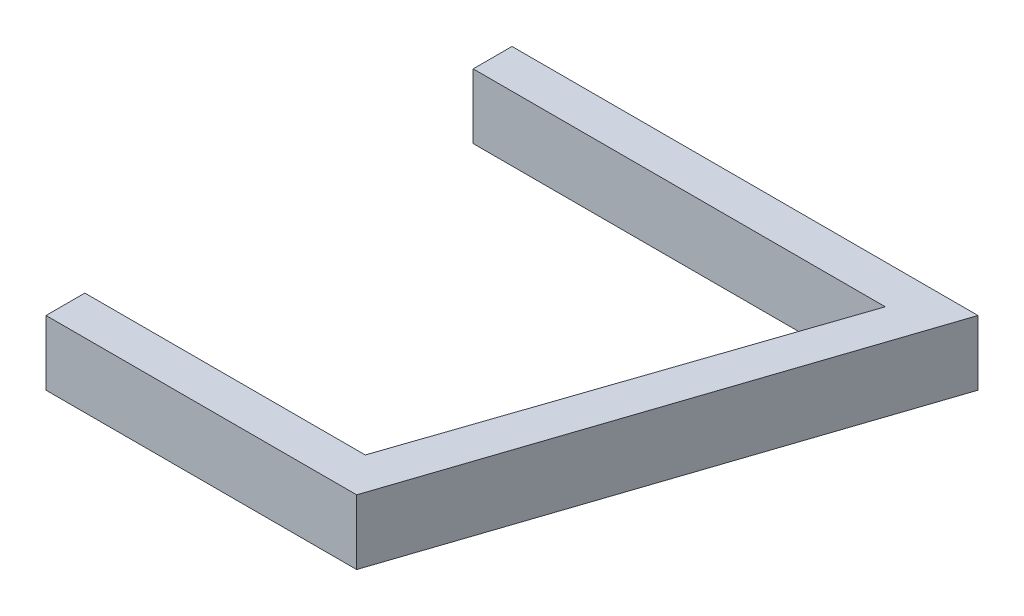
ISO-10303-21;
HEADER;
FILE_DESCRIPTION(('STEP AP214'),'2;1');
FILE_NAME('part.step','',(''),(''),'','','');
FILE_SCHEMA(('AUTOMOTIVE_DESIGN { 1 0 10303 214 1 1 1 1 }'));
ENDSEC;
DATA;
#1=APPLICATION_CONTEXT('core data for automotive mechanical design processes');
#2=APPLICATION_PROTOCOL_DEFINITION('international standard','automotive_design',2000,#1);
#3=PRODUCT_CONTEXT('',#1,'mechanical');
#4=PRODUCT('Part','Part','',(#3));
#5=PRODUCT_RELATED_PRODUCT_CATEGORY('part','',(#4));
#6=PRODUCT_DEFINITION_FORMATION('','',#4);
#7=PRODUCT_DEFINITION_CONTEXT('part definition',#1,'design');
#8=PRODUCT_DEFINITION('design','',#6,#7);
#9=PRODUCT_DEFINITION_SHAPE('','',#8);
#10=(LENGTH_UNIT() NAMED_UNIT(*) SI_UNIT(.MILLI.,.METRE.));
#11=(NAMED_UNIT(*) PLANE_ANGLE_UNIT() SI_UNIT($,.RADIAN.));
#12=(NAMED_UNIT(*) SI_UNIT($,.STERADIAN.) SOLID_ANGLE_UNIT());
#13=UNCERTAINTY_MEASURE_WITH_UNIT(LENGTH_MEASURE(1.E-05),#10,'distance_accuracy_value','');
#14=(GEOMETRIC_REPRESENTATION_CONTEXT(3) GLOBAL_UNCERTAINTY_ASSIGNED_CONTEXT((#13)) GLOBAL_UNIT_ASSIGNED_CONTEXT((#10,
#11,#12)) REPRESENTATION_CONTEXT('',''));
#15=CARTESIAN_POINT('',(0.,0.,0.));
#16=DIRECTION('',(0.,0.,1.));
#17=DIRECTION('',(1.,0.,0.));
#18=AXIS2_PLACEMENT_3D('',#15,#16,#17);
#19=CARTESIAN_POINT('',(-228.6,63.5,0.));
#20=DIRECTION('',(1.,0.,0.));
#21=DIRECTION('',(0.,0.,-1.));
#22=AXIS2_PLACEMENT_3D('',#19,#20,#21);
#23=PLANE('',#22);
#24=DIRECTION('',(0.,0.,1.));
#25=VECTOR('',#24,1.);
#26=CARTESIAN_POINT('',(-228.6,0.,0.));
#27=LINE('',#26,#25);
#28=CARTESIAN_POINT('',(-228.6,0.,0.));
#29=VERTEX_POINT('',#28);
#30=CARTESIAN_POINT('',(-228.6,0.,38.1));
#31=VERTEX_POINT('',#30);
#32=EDGE_CURVE('E129',#29,#31,#27,.T.);
#33=ORIENTED_EDGE('',*,*,#32,.T.);
#34=DIRECTION('',(0.,-1.,0.));
#35=VECTOR('',#34,1.);
#36=CARTESIAN_POINT('',(-228.6,63.5,38.1));
#37=LINE('',#36,#35);
#38=CARTESIAN_POINT('',(-228.6,63.5,38.1));
#39=VERTEX_POINT('',#38);
#40=EDGE_CURVE('E11',#39,#31,#37,.T.);
#41=ORIENTED_EDGE('',*,*,#40,.F.);
#42=DIRECTION('',(0.,0.,1.));
#43=VECTOR('',#42,1.);
#44=CARTESIAN_POINT('',(-228.6,63.5,0.));
#45=LINE('',#44,#43);
#46=CARTESIAN_POINT('',(-228.6,63.5,0.));
#47=VERTEX_POINT('',#46);
#48=EDGE_CURVE('E143',#47,#39,#45,.T.);
#49=ORIENTED_EDGE('',*,*,#48,.F.);
#50=DIRECTION('',(0.,-1.,0.));
#51=VECTOR('',#50,1.);
#52=CARTESIAN_POINT('',(-228.6,63.5,0.));
#53=LINE('',#52,#51);
#54=EDGE_CURVE('E125',#47,#29,#53,.T.);
#55=ORIENTED_EDGE('',*,*,#54,.T.);
#56=EDGE_LOOP('',(#33,#41,#49,#55));
#57=FACE_BOUND('',#56,.T.);
#58=ADVANCED_FACE('F33',(#57),#23,.F.);
#59=CARTESIAN_POINT('',(-228.6,63.5,38.1));
#60=DIRECTION('',(0.,0.,-1.));
#61=DIRECTION('',(-1.,0.,0.));
#62=AXIS2_PLACEMENT_3D('',#59,#60,#61);
#63=PLANE('',#62);
#64=DIRECTION('',(1.,0.,0.));
#65=VECTOR('',#64,1.);
#66=CARTESIAN_POINT('',(-228.6,0.,38.1));
#67=LINE('',#66,#65);
#68=CARTESIAN_POINT('',(175.739073715862,0.,38.0999999999999));
#69=VERTEX_POINT('',#68);
#70=EDGE_CURVE('E132',#31,#69,#67,.T.);
#71=ORIENTED_EDGE('',*,*,#70,.T.);
#72=DIRECTION('',(0.,-1.,0.));
#73=VECTOR('',#72,1.);
#74=CARTESIAN_POINT('',(175.739073715862,63.5,38.0999999999999));
#75=LINE('',#74,#73);
#76=CARTESIAN_POINT('',(175.739073715862,63.5,38.0999999999999));
#77=VERTEX_POINT('',#76);
#78=EDGE_CURVE('E41',#77,#69,#75,.T.);
#79=ORIENTED_EDGE('',*,*,#78,.F.);
#80=DIRECTION('',(1.,0.,0.));
#81=VECTOR('',#80,1.);
#82=CARTESIAN_POINT('',(-228.6,63.5,38.1));
#83=LINE('',#82,#81);
#84=EDGE_CURVE('E92',#39,#77,#83,.T.);
#85=ORIENTED_EDGE('',*,*,#84,.F.);
#86=ORIENTED_EDGE('',*,*,#40,.T.);
#87=EDGE_LOOP('',(#71,#79,#85,#86));
#88=FACE_BOUND('',#87,.T.);
#89=ADVANCED_FACE('F178',(#88),#63,.F.);
#90=CARTESIAN_POINT('',(175.739073715862,63.5,38.0999999999999));
#91=DIRECTION('',(0.947050865355972,0.,0.321083569228488));
#92=DIRECTION('',(0.321083569228488,0.,-0.947050865355972));
#93=AXIS2_PLACEMENT_3D('',#90,#91,#92);
#94=PLANE('',#93);
#95=DIRECTION('',(-0.321083569228488,0.,0.947050865355972));
#96=VECTOR('',#95,1.);
#97=CARTESIAN_POINT('',(175.739073715862,0.,38.0999999999999));
#98=LINE('',#97,#96);
#99=CARTESIAN_POINT('',(46.5666666666668,0.,419.1));
#100=VERTEX_POINT('',#99);
#101=EDGE_CURVE('E134',#69,#100,#98,.T.);
#102=ORIENTED_EDGE('',*,*,#101,.T.);
#103=DIRECTION('',(0.,-1.,0.));
#104=VECTOR('',#103,1.);
#105=CARTESIAN_POINT('',(46.5666666666668,63.5,419.1));
#106=LINE('',#105,#104);
#107=CARTESIAN_POINT('',(46.5666666666668,63.5,419.1));
#108=VERTEX_POINT('',#107);
#109=EDGE_CURVE('E150',#108,#100,#106,.T.);
#110=ORIENTED_EDGE('',*,*,#109,.F.);
#111=DIRECTION('',(-0.321083569228488,0.,0.947050865355972));
#112=VECTOR('',#111,1.);
#113=CARTESIAN_POINT('',(175.739073715862,63.5,38.0999999999999));
#114=LINE('',#113,#112);
#115=EDGE_CURVE('E158',#77,#108,#114,.T.);
#116=ORIENTED_EDGE('',*,*,#115,.F.);
#117=ORIENTED_EDGE('',*,*,#78,.T.);
#118=EDGE_LOOP('',(#102,#110,#116,#117));
#119=FACE_BOUND('',#118,.T.);
#120=ADVANCED_FACE('F156',(#119),#94,.F.);
#121=CARTESIAN_POINT('',(-228.6,63.5,419.1));
#122=DIRECTION('',(0.,0.,1.));
#123=DIRECTION('',(1.,0.,0.));
#124=AXIS2_PLACEMENT_3D('',#121,#122,#123);
#125=PLANE('',#124);
#126=DIRECTION('',(-1.,0.,0.));
#127=VECTOR('',#126,1.);
#128=CARTESIAN_POINT('',(-228.6,0.,419.1));
#129=LINE('',#128,#127);
#130=CARTESIAN_POINT('',(-228.6,0.,419.1));
#131=VERTEX_POINT('',#130);
#132=EDGE_CURVE('E136',#100,#131,#129,.T.);
#133=ORIENTED_EDGE('',*,*,#132,.T.);
#134=DIRECTION('',(0.,-1.,0.));
#135=VECTOR('',#134,1.);
#136=CARTESIAN_POINT('',(-228.6,63.5,419.1));
#137=LINE('',#136,#135);
#138=CARTESIAN_POINT('',(-228.6,63.5,419.1));
#139=VERTEX_POINT('',#138);
#140=EDGE_CURVE('E147',#139,#131,#137,.T.);
#141=ORIENTED_EDGE('',*,*,#140,.F.);
#142=DIRECTION('',(-1.,0.,0.));
#143=VECTOR('',#142,1.);
#144=CARTESIAN_POINT('',(-228.6,63.5,419.1));
#145=LINE('',#144,#143);
#146=EDGE_CURVE('E170',#108,#139,#145,.T.);
#147=ORIENTED_EDGE('',*,*,#146,.F.);
#148=ORIENTED_EDGE('',*,*,#109,.T.);
#149=EDGE_LOOP('',(#133,#141,#147,#148));
#150=FACE_BOUND('',#149,.T.);
#151=ADVANCED_FACE('F166',(#150),#125,.F.);
#152=CARTESIAN_POINT('',(-228.6,63.5,457.2));
#153=DIRECTION('',(1.,0.,0.));
#154=DIRECTION('',(0.,0.,-1.));
#155=AXIS2_PLACEMENT_3D('',#152,#153,#154);
#156=PLANE('',#155);
#157=DIRECTION('',(0.,0.,1.));
#158=VECTOR('',#157,1.);
#159=CARTESIAN_POINT('',(-228.6,0.,457.2));
#160=LINE('',#159,#158);
#161=CARTESIAN_POINT('',(-228.6,0.,457.2));
#162=VERTEX_POINT('',#161);
#163=EDGE_CURVE('E138',#131,#162,#160,.T.);
#164=ORIENTED_EDGE('',*,*,#163,.T.);
#165=DIRECTION('',(0.,-1.,0.));
#166=VECTOR('',#165,1.);
#167=CARTESIAN_POINT('',(-228.6,63.5,457.2));
#168=LINE('',#167,#166);
#169=CARTESIAN_POINT('',(-228.6,63.5,457.2));
#170=VERTEX_POINT('',#169);
#171=EDGE_CURVE('E120',#170,#162,#168,.T.);
#172=ORIENTED_EDGE('',*,*,#171,.F.);
#173=DIRECTION('',(0.,0.,1.));
#174=VECTOR('',#173,1.);
#175=CARTESIAN_POINT('',(-228.6,63.5,457.2));
#176=LINE('',#175,#174);
#177=EDGE_CURVE('E111',#139,#170,#176,.T.);
#178=ORIENTED_EDGE('',*,*,#177,.F.);
#179=ORIENTED_EDGE('',*,*,#140,.T.);
#180=EDGE_LOOP('',(#164,#172,#178,#179));
#181=FACE_BOUND('',#180,.T.);
#182=ADVANCED_FACE('F169',(#181),#156,.F.);
#183=CARTESIAN_POINT('',(-228.6,63.5,457.2));
#184=DIRECTION('',(0.,0.,-1.));
#185=DIRECTION('',(-1.,0.,0.));
#186=AXIS2_PLACEMENT_3D('',#183,#184,#185);
#187=PLANE('',#186);
#188=DIRECTION('',(1.,0.,0.));
#189=VECTOR('',#188,1.);
#190=CARTESIAN_POINT('',(-228.6,0.,457.2));
#191=LINE('',#190,#189);
#192=CARTESIAN_POINT('',(76.2000000000001,0.,457.2));
#193=VERTEX_POINT('',#192);
#194=EDGE_CURVE('E119',#162,#193,#191,.T.);
#195=ORIENTED_EDGE('',*,*,#194,.T.);
#196=DIRECTION('',(0.,-1.,0.));
#197=VECTOR('',#196,1.);
#198=CARTESIAN_POINT('',(76.2000000000001,63.5,457.2));
#199=LINE('',#198,#197);
#200=CARTESIAN_POINT('',(76.2000000000001,63.5,457.2));
#201=VERTEX_POINT('',#200);
#202=EDGE_CURVE('E116',#201,#193,#199,.T.);
#203=ORIENTED_EDGE('',*,*,#202,.F.);
#204=DIRECTION('',(1.,0.,0.));
#205=VECTOR('',#204,1.);
#206=CARTESIAN_POINT('',(-228.6,63.5,457.2));
#207=LINE('',#206,#205);
#208=EDGE_CURVE('E105',#170,#201,#207,.T.);
#209=ORIENTED_EDGE('',*,*,#208,.F.);
#210=ORIENTED_EDGE('',*,*,#171,.T.);
#211=EDGE_LOOP('',(#195,#203,#209,#210));
#212=FACE_BOUND('',#211,.T.);
#213=ADVANCED_FACE('F117',(#212),#187,.F.);
#214=CARTESIAN_POINT('',(76.2000000000001,63.5,457.2));
#215=DIRECTION('',(-0.948683298050514,0.,-0.316227766016838));
#216=DIRECTION('',(-0.316227766016838,0.,0.948683298050514));
#217=AXIS2_PLACEMENT_3D('',#214,#215,#216);
#218=PLANE('',#217);
#219=DIRECTION('',(0.316227766016838,0.,-0.948683298050514));
#220=VECTOR('',#219,1.);
#221=CARTESIAN_POINT('',(76.2000000000001,0.,457.2));
#222=LINE('',#221,#220);
#223=CARTESIAN_POINT('',(228.6,0.,0.));
#224=VERTEX_POINT('',#223);
#225=EDGE_CURVE('E78',#193,#224,#222,.T.);
#226=ORIENTED_EDGE('',*,*,#225,.T.);
#227=DIRECTION('',(0.,-1.,0.));
#228=VECTOR('',#227,1.);
#229=CARTESIAN_POINT('',(228.6,63.5,0.));
#230=LINE('',#229,#228);
#231=CARTESIAN_POINT('',(228.6,63.5,0.));
#232=VERTEX_POINT('',#231);
#233=EDGE_CURVE('E121',#232,#224,#230,.T.);
#234=ORIENTED_EDGE('',*,*,#233,.F.);
#235=DIRECTION('',(0.316227766016838,0.,-0.948683298050514));
#236=VECTOR('',#235,1.);
#237=CARTESIAN_POINT('',(76.2000000000001,63.5,457.2));
#238=LINE('',#237,#236);
#239=EDGE_CURVE('E109',#201,#232,#238,.T.);
#240=ORIENTED_EDGE('',*,*,#239,.F.);
#241=ORIENTED_EDGE('',*,*,#202,.T.);
#242=EDGE_LOOP('',(#226,#234,#240,#241));
#243=FACE_BOUND('',#242,.T.);
#244=ADVANCED_FACE('F123',(#243),#218,.F.);
#245=CARTESIAN_POINT('',(-228.6,63.5,0.));
#246=DIRECTION('',(0.,0.,1.));
#247=DIRECTION('',(1.,0.,0.));
#248=AXIS2_PLACEMENT_3D('',#245,#246,#247);
#249=PLANE('',#248);
#250=DIRECTION('',(-1.,0.,0.));
#251=VECTOR('',#250,1.);
#252=CARTESIAN_POINT('',(-228.6,0.,0.));
#253=LINE('',#252,#251);
#254=EDGE_CURVE('E84',#224,#29,#253,.T.);
#255=ORIENTED_EDGE('',*,*,#254,.T.);
#256=ORIENTED_EDGE('',*,*,#54,.F.);
#257=DIRECTION('',(-1.,0.,0.));
#258=VECTOR('',#257,1.);
#259=CARTESIAN_POINT('',(-228.6,63.5,0.));
#260=LINE('',#259,#258);
#261=EDGE_CURVE('E49',#232,#47,#260,.T.);
#262=ORIENTED_EDGE('',*,*,#261,.F.);
#263=ORIENTED_EDGE('',*,*,#233,.T.);
#264=EDGE_LOOP('',(#255,#256,#262,#263));
#265=FACE_BOUND('',#264,.T.);
#266=ADVANCED_FACE('F194',(#265),#249,.F.);
#267=CARTESIAN_POINT('',(0.,63.5,0.));
#268=DIRECTION('',(0.,1.,0.));
#269=DIRECTION('',(0.,0.,1.));
#270=AXIS2_PLACEMENT_3D('',#267,#268,#269);
#271=PLANE('',#270);
#272=ORIENTED_EDGE('',*,*,#48,.T.);
#273=ORIENTED_EDGE('',*,*,#84,.T.);
#274=ORIENTED_EDGE('',*,*,#115,.T.);
#275=ORIENTED_EDGE('',*,*,#146,.T.);
#276=ORIENTED_EDGE('',*,*,#177,.T.);
#277=ORIENTED_EDGE('',*,*,#208,.T.);
#278=ORIENTED_EDGE('',*,*,#239,.T.);
#279=ORIENTED_EDGE('',*,*,#261,.T.);
#280=EDGE_LOOP('',(#272,#273,#274,#275,#276,#277,#278,#279));
#281=FACE_BOUND('',#280,.T.);
#282=ADVANCED_FACE('F107',(#281),#271,.T.);
#283=CARTESIAN_POINT('',(0.,0.,0.));
#284=DIRECTION('',(0.,1.,0.));
#285=DIRECTION('',(0.,0.,1.));
#286=AXIS2_PLACEMENT_3D('',#283,#284,#285);
#287=PLANE('',#286);
#288=ORIENTED_EDGE('',*,*,#32,.F.);
#289=ORIENTED_EDGE('',*,*,#254,.F.);
#290=ORIENTED_EDGE('',*,*,#225,.F.);
#291=ORIENTED_EDGE('',*,*,#194,.F.);
#292=ORIENTED_EDGE('',*,*,#163,.F.);
#293=ORIENTED_EDGE('',*,*,#132,.F.);
#294=ORIENTED_EDGE('',*,*,#101,.F.);
#295=ORIENTED_EDGE('',*,*,#70,.F.);
#296=EDGE_LOOP('',(#288,#289,#290,#291,#292,#293,#294,#295));
#297=FACE_BOUND('',#296,.T.);
#298=ADVANCED_FACE('F162',(#297),#287,.F.);
#299=CLOSED_SHELL('',(#58,#89,#120,#151,#182,#213,#244,#266,#282,#298));
#300=MANIFOLD_SOLID_BREP('B2',#299);
#301=ADVANCED_BREP_SHAPE_REPRESENTATION('',(#18,#300),#14);
#302=SHAPE_DEFINITION_REPRESENTATION(#9,#301);
ENDSEC;
END-ISO-10303-21;
